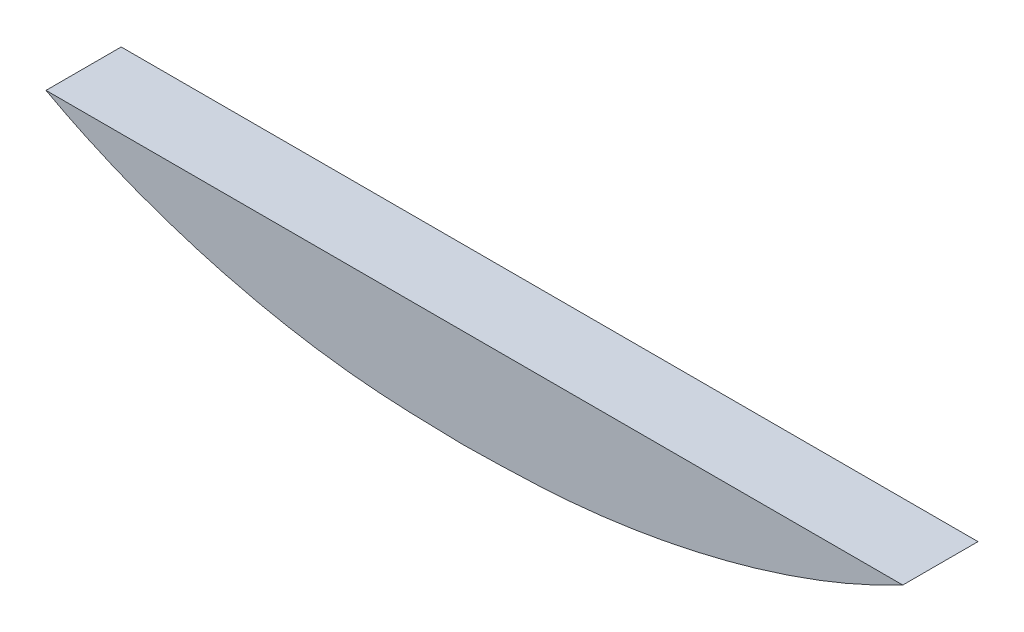
ISO-10303-21;
HEADER;
FILE_DESCRIPTION(('STEP AP214'),'2;1');
FILE_NAME('part.step','',(''),(''),'','','');
FILE_SCHEMA(('AUTOMOTIVE_DESIGN { 1 0 10303 214 1 1 1 1 }'));
ENDSEC;
DATA;
#1=APPLICATION_CONTEXT('core data for automotive mechanical design processes');
#2=APPLICATION_PROTOCOL_DEFINITION('international standard','automotive_design',2000,#1);
#3=PRODUCT_CONTEXT('',#1,'mechanical');
#4=PRODUCT('Part','Part','',(#3));
#5=PRODUCT_RELATED_PRODUCT_CATEGORY('part','',(#4));
#6=PRODUCT_DEFINITION_FORMATION('','',#4);
#7=PRODUCT_DEFINITION_CONTEXT('part definition',#1,'design');
#8=PRODUCT_DEFINITION('design','',#6,#7);
#9=PRODUCT_DEFINITION_SHAPE('','',#8);
#10=(LENGTH_UNIT() NAMED_UNIT(*) SI_UNIT(.MILLI.,.METRE.));
#11=(NAMED_UNIT(*) PLANE_ANGLE_UNIT() SI_UNIT($,.RADIAN.));
#12=(NAMED_UNIT(*) SI_UNIT($,.STERADIAN.) SOLID_ANGLE_UNIT());
#13=UNCERTAINTY_MEASURE_WITH_UNIT(LENGTH_MEASURE(1.E-05),#10,'distance_accuracy_value','');
#14=(GEOMETRIC_REPRESENTATION_CONTEXT(3) GLOBAL_UNCERTAINTY_ASSIGNED_CONTEXT((#13)) GLOBAL_UNIT_ASSIGNED_CONTEXT((#10,
#11,#12)) REPRESENTATION_CONTEXT('',''));
#15=CARTESIAN_POINT('',(0.,0.,0.));
#16=DIRECTION('',(0.,0.,1.));
#17=DIRECTION('',(1.,0.,0.));
#18=AXIS2_PLACEMENT_3D('',#15,#16,#17);
#19=CARTESIAN_POINT('',(0.,0.,0.));
#20=DIRECTION('',(0.,0.,-1.));
#21=DIRECTION('',(-1.,0.,0.));
#22=AXIS2_PLACEMENT_3D('',#19,#20,#21);
#23=PLANE('',#22);
#24=CARTESIAN_POINT('',(5.76923076923079,4.83774038461538,0.));
#25=CARTESIAN_POINT('',(5.76559753253748,4.62107828632409,0.));
#26=CARTESIAN_POINT('',(5.75847416780461,4.19628813908102,0.));
#27=CARTESIAN_POINT('',(5.67364275234917,3.57634561138139,0.));
#28=CARTESIAN_POINT('',(5.56049023234097,2.98466710580137,0.));
#29=CARTESIAN_POINT('',(5.38010372830871,2.42729215161989,0.));
#30=CARTESIAN_POINT('',(5.16279039895238,1.8961287409815,0.));
#31=CARTESIAN_POINT('',(4.88034990033308,1.40337584742006,0.));
#32=CARTESIAN_POINT('',(4.56234879705193,0.934299189069977,0.));
#33=CARTESIAN_POINT('',(4.18974893379179,0.504612898451396,0.));
#34=CARTESIAN_POINT('',(3.77783898339826,0.114812101552504,0.));
#35=CARTESIAN_POINT('',(3.32794970507642,-0.224941250153386,0.));
#36=CARTESIAN_POINT('',(2.845763670524,-0.515776018395924,0.));
#37=CARTESIAN_POINT('',(2.32680117156969,-0.749856785619088,0.));
#38=CARTESIAN_POINT('',(1.77417436897692,-0.930133405348942,0.));
#39=CARTESIAN_POINT('',(1.18911678898298,-1.06285336343452,0.));
#40=CARTESIAN_POINT('',(0.569085331114844,-1.14190466031389,0.));
#41=CARTESIAN_POINT('',(0.144461754934995,-1.14981269841211,0.));
#42=CARTESIAN_POINT('',(-0.0721153846153684,-1.15384615384615,0.));
#43=B_SPLINE_CURVE_WITH_KNOTS('',3,(#24,#25,#26,#27,#28,#29,#30,#31,#32,#33,#34,#35,#36,#37,#38,
#39,#40,#41,#42),.UNSPECIFIED.,.F.,.F.,(4,1,1,1,1,1,1,1,1,1,1,1,1,1,1,1,4),(0.,
0.0688877507567127,0.135062099084096,0.198816097167165,0.260302455571233,0.321151150591035,
0.381081487065822,0.440665068442198,0.501229320566076,0.561652530159204,0.620804960677879,
0.680272507705816,0.740463287087672,0.801538582632135,0.864937900915904,0.931112249243287,1.),.UNSPECIFIED.);
#44=CARTESIAN_POINT('',(2.85167830894443,-0.500000000151267,0.));
#45=VERTEX_POINT('',#44);
#46=CARTESIAN_POINT('',(-0.0721153846153684,-1.15384615384615,0.));
#47=VERTEX_POINT('',#46);
#48=EDGE_CURVE('E11',#45,#47,#43,.T.);
#49=ORIENTED_EDGE('',*,*,#48,.T.);
#50=CARTESIAN_POINT('',(-0.0721153846153684,-1.15384615384615,0.));
#51=CARTESIAN_POINT('',(-0.274685081191588,-1.14977328158864,0.));
#52=CARTESIAN_POINT('',(-0.673387563703523,-1.14175695778765,0.));
#53=CARTESIAN_POINT('',(-1.25744480672721,-1.06236867003036,0.));
#54=CARTESIAN_POINT('',(-1.81240898425206,-0.929402575974411,0.));
#55=CARTESIAN_POINT('',(-2.34077180885591,-0.748629574870465,0.));
#56=CARTESIAN_POINT('',(-2.84167690098609,-0.514629744057609,0.));
#57=CARTESIAN_POINT('',(-3.31175597519857,-0.221483770104905,0.));
#58=CARTESIAN_POINT('',(-3.76009599169457,0.114387101471254,0.));
#59=CARTESIAN_POINT('',(-4.17355440197439,0.506835821336498,0.));
#60=CARTESIAN_POINT('',(-4.55144025189374,0.941353294188342,0.));
#61=CARTESIAN_POINT('',(-4.87824124380278,1.4222321795736,0.));
#62=CARTESIAN_POINT('',(-5.15731176174261,1.94073957222652,0.));
#63=CARTESIAN_POINT('',(-5.3769686596106,2.50302151604002,0.));
#64=CARTESIAN_POINT('',(-5.55290341998866,3.10215532273428,0.));
#65=CARTESIAN_POINT('',(-5.67677317981351,3.74193419395728,0.));
#66=CARTESIAN_POINT('',(-5.75789330980674,4.42099239122179,0.));
#67=CARTESIAN_POINT('',(-5.76539445965032,4.88757685002568,0.));
#68=CARTESIAN_POINT('',(-5.76923076923075,5.12620192307692,0.));
#69=B_SPLINE_CURVE_WITH_KNOTS('',3,(#50,#51,#52,#53,#54,#55,#56,#57,#58,#59,#60,#61,#62,#63,#64,
#65,#66,#67,#68),.UNSPECIFIED.,.F.,.F.,(4,1,1,1,1,1,1,1,1,1,1,1,1,1,1,1,4),(0.,
0.0635627947613132,0.125105800596373,0.184590363575065,0.242460879472413,0.300129463155241,
0.357722568856944,0.416079614598885,0.475690352064488,0.536327121957145,0.596502370765227,
0.657832970047864,0.72077370375448,0.785645050612482,0.853597783500185,0.925125582415045,1.),.UNSPECIFIED.);
#70=CARTESIAN_POINT('',(-2.84537183016369,-0.50000000013943,0.));
#71=VERTEX_POINT('',#70);
#72=EDGE_CURVE('E90',#47,#71,#69,.T.);
#73=ORIENTED_EDGE('',*,*,#72,.T.);
#74=DIRECTION('',(1.,0.,0.));
#75=VECTOR('',#74,1.);
#76=CARTESIAN_POINT('',(-17.,-0.5,0.));
#77=LINE('',#76,#75);
#78=EDGE_CURVE('E45',#45,#71,#77,.F.);
#79=ORIENTED_EDGE('',*,*,#78,.F.);
#80=EDGE_LOOP('',(#49,#73,#79));
#81=FACE_BOUND('',#80,.T.);
#82=ADVANCED_FACE('F39',(#81),#23,.T.);
#83=CARTESIAN_POINT('',(5.76923076923079,4.83774038461538,0.5));
#84=CARTESIAN_POINT('',(5.76559753253748,4.62107828632409,0.5));
#85=CARTESIAN_POINT('',(5.75847416780461,4.19628813908102,0.5));
#86=CARTESIAN_POINT('',(5.67364275234917,3.57634561138139,0.5));
#87=CARTESIAN_POINT('',(5.56049023234097,2.98466710580137,0.5));
#88=CARTESIAN_POINT('',(5.38010372830871,2.42729215161989,0.5));
#89=CARTESIAN_POINT('',(5.16279039895238,1.8961287409815,0.5));
#90=CARTESIAN_POINT('',(4.88034990033308,1.40337584742006,0.5));
#91=CARTESIAN_POINT('',(4.56234879705193,0.934299189069977,0.5));
#92=CARTESIAN_POINT('',(4.18974893379179,0.504612898451396,0.5));
#93=CARTESIAN_POINT('',(3.77783898339826,0.114812101552504,0.5));
#94=CARTESIAN_POINT('',(3.32794970507642,-0.224941250153386,0.5));
#95=CARTESIAN_POINT('',(2.845763670524,-0.515776018395924,0.5));
#96=CARTESIAN_POINT('',(2.32680117156969,-0.749856785619088,0.5));
#97=CARTESIAN_POINT('',(1.77417436897692,-0.930133405348942,0.5));
#98=CARTESIAN_POINT('',(1.18911678898298,-1.06285336343452,0.5));
#99=CARTESIAN_POINT('',(0.569085331114844,-1.14190466031389,0.5));
#100=CARTESIAN_POINT('',(0.144461754934995,-1.14981269841211,0.5));
#101=CARTESIAN_POINT('',(-0.0721153846153684,-1.15384615384615,0.5));
#102=B_SPLINE_CURVE_WITH_KNOTS('',3,(#83,#84,#85,#86,#87,#88,#89,#90,#91,#92,#93,#94,#95,#96,
#97,#98,#99,#100,#101),.UNSPECIFIED.,.F.,.F.,(4,1,1,1,1,1,1,1,1,1,1,1,1,1,1,1,4),(0.,
0.0688877507567127,0.135062099084096,0.198816097167165,0.260302455571233,0.321151150591035,
0.381081487065822,0.440665068442198,0.501229320566076,0.561652530159204,0.620804960677879,
0.680272507705816,0.740463287087672,0.801538582632135,0.864937900915904,0.931112249243287,1.),.UNSPECIFIED.);
#103=DIRECTION('',(0.,0.,-1.));
#104=VECTOR('',#103,1.);
#105=SURFACE_OF_LINEAR_EXTRUSION('',#102,#104);
#106=DIRECTION('',(0.,0.,-1.));
#107=VECTOR('',#106,1.);
#108=CARTESIAN_POINT('',(2.85167830923094,-0.5,0.5));
#109=LINE('',#108,#107);
#110=CARTESIAN_POINT('',(2.85167830908769,-0.500000000075634,0.5));
#111=VERTEX_POINT('',#110);
#112=EDGE_CURVE('E82',#45,#111,#109,.F.);
#113=ORIENTED_EDGE('',*,*,#112,.T.);
#114=CARTESIAN_POINT('',(-0.0721153846153684,-1.15384615384615,0.5));
#115=VERTEX_POINT('',#114);
#116=EDGE_CURVE('E71',#111,#115,#102,.T.);
#117=ORIENTED_EDGE('',*,*,#116,.T.);
#118=DIRECTION('',(0.,0.,-1.));
#119=VECTOR('',#118,1.);
#120=CARTESIAN_POINT('',(-0.0721153846153684,-1.15384615384615,0.5));
#121=LINE('',#120,#119);
#122=EDGE_CURVE('E79',#115,#47,#121,.T.);
#123=ORIENTED_EDGE('',*,*,#122,.T.);
#124=ORIENTED_EDGE('',*,*,#48,.F.);
#125=EDGE_LOOP('',(#113,#117,#123,#124));
#126=FACE_BOUND('',#125,.T.);
#127=ADVANCED_FACE('F87',(#126),#105,.T.);
#128=CARTESIAN_POINT('',(-0.0721153846153684,-1.15384615384615,0.5));
#129=CARTESIAN_POINT('',(-0.274685081191588,-1.14977328158864,0.5));
#130=CARTESIAN_POINT('',(-0.673387563703523,-1.14175695778765,0.5));
#131=CARTESIAN_POINT('',(-1.25744480672721,-1.06236867003036,0.5));
#132=CARTESIAN_POINT('',(-1.81240898425206,-0.929402575974411,0.5));
#133=CARTESIAN_POINT('',(-2.34077180885591,-0.748629574870465,0.5));
#134=CARTESIAN_POINT('',(-2.84167690098609,-0.514629744057609,0.5));
#135=CARTESIAN_POINT('',(-3.31175597519857,-0.221483770104905,0.5));
#136=CARTESIAN_POINT('',(-3.76009599169457,0.114387101471254,0.5));
#137=CARTESIAN_POINT('',(-4.17355440197439,0.506835821336498,0.5));
#138=CARTESIAN_POINT('',(-4.55144025189374,0.941353294188342,0.5));
#139=CARTESIAN_POINT('',(-4.87824124380278,1.4222321795736,0.5));
#140=CARTESIAN_POINT('',(-5.15731176174261,1.94073957222652,0.5));
#141=CARTESIAN_POINT('',(-5.3769686596106,2.50302151604002,0.5));
#142=CARTESIAN_POINT('',(-5.55290341998866,3.10215532273428,0.5));
#143=CARTESIAN_POINT('',(-5.67677317981351,3.74193419395728,0.5));
#144=CARTESIAN_POINT('',(-5.75789330980674,4.42099239122179,0.5));
#145=CARTESIAN_POINT('',(-5.76539445965032,4.88757685002568,0.5));
#146=CARTESIAN_POINT('',(-5.76923076923075,5.12620192307692,0.5));
#147=B_SPLINE_CURVE_WITH_KNOTS('',3,(#128,#129,#130,#131,#132,#133,#134,#135,#136,#137,#138,
#139,#140,#141,#142,#143,#144,#145,#146),.UNSPECIFIED.,.F.,.F.,(4,1,1,1,1,1,1,1,1,1,1,1,1,1,1,1,
4),(0.,0.0635627947613132,0.125105800596373,0.184590363575065,0.242460879472413,
0.300129463155241,0.357722568856944,0.416079614598885,0.475690352064488,0.536327121957145,
0.596502370765227,0.657832970047864,0.72077370375448,0.785645050612482,0.853597783500185,
0.925125582415045,1.),.UNSPECIFIED.);
#148=DIRECTION('',(0.,0.,-1.));
#149=VECTOR('',#148,1.);
#150=SURFACE_OF_LINEAR_EXTRUSION('',#147,#149);
#151=DIRECTION('',(0.,0.,-1.));
#152=VECTOR('',#151,1.);
#153=CARTESIAN_POINT('',(-2.8453718304188,-0.500000000000299,0.5));
#154=LINE('',#153,#152);
#155=CARTESIAN_POINT('',(-2.84537183029126,-0.500000000069893,0.5));
#156=VERTEX_POINT('',#155);
#157=EDGE_CURVE('E53',#156,#71,#154,.T.);
#158=ORIENTED_EDGE('',*,*,#157,.T.);
#159=ORIENTED_EDGE('',*,*,#72,.F.);
#160=ORIENTED_EDGE('',*,*,#122,.F.);
#161=EDGE_CURVE('E76',#115,#156,#147,.T.);
#162=ORIENTED_EDGE('',*,*,#161,.T.);
#163=EDGE_LOOP('',(#158,#159,#160,#162));
#164=FACE_BOUND('',#163,.T.);
#165=ADVANCED_FACE('F115',(#164),#150,.T.);
#166=CARTESIAN_POINT('',(-17.,-0.5,1.));
#167=DIRECTION('',(0.,-1.,0.));
#168=DIRECTION('',(0.,0.,-1.));
#169=AXIS2_PLACEMENT_3D('',#166,#167,#168);
#170=PLANE('',#169);
#171=DIRECTION('',(-1.,0.,0.));
#172=VECTOR('',#171,1.);
#173=CARTESIAN_POINT('',(-17.,-0.5,0.5));
#174=LINE('',#173,#172);
#175=EDGE_CURVE('E77',#111,#156,#174,.T.);
#176=ORIENTED_EDGE('',*,*,#175,.F.);
#177=ORIENTED_EDGE('',*,*,#112,.F.);
#178=ORIENTED_EDGE('',*,*,#78,.T.);
#179=ORIENTED_EDGE('',*,*,#157,.F.);
#180=EDGE_LOOP('',(#176,#177,#178,#179));
#181=FACE_BOUND('',#180,.T.);
#182=ADVANCED_FACE('F81',(#181),#170,.F.);
#183=CARTESIAN_POINT('',(8.17034628619698,1.29686234703217,0.5));
#184=DIRECTION('',(0.,0.,1.));
#185=DIRECTION('',(1.,0.,0.));
#186=AXIS2_PLACEMENT_3D('',#183,#184,#185);
#187=PLANE('',#186);
#188=ORIENTED_EDGE('',*,*,#175,.T.);
#189=ORIENTED_EDGE('',*,*,#161,.F.);
#190=ORIENTED_EDGE('',*,*,#116,.F.);
#191=EDGE_LOOP('',(#188,#189,#190));
#192=FACE_BOUND('',#191,.T.);
#193=ADVANCED_FACE('F78',(#192),#187,.T.);
#194=CLOSED_SHELL('',(#82,#127,#165,#182,#193));
#195=MANIFOLD_SOLID_BREP('B2',#194);
#196=ADVANCED_BREP_SHAPE_REPRESENTATION('',(#18,#195),#14);
#197=SHAPE_DEFINITION_REPRESENTATION(#9,#196);
ENDSEC;
END-ISO-10303-21;
